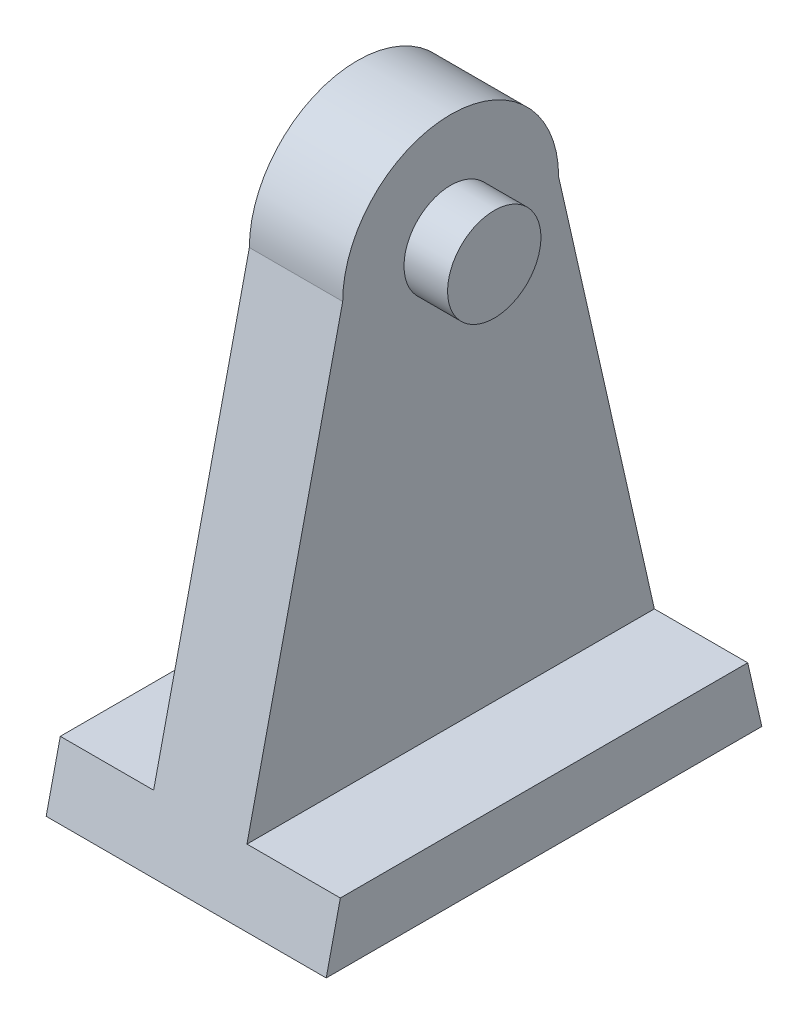
ISO-10303-21;
HEADER;
FILE_DESCRIPTION(('STEP AP214'),'2;1');
FILE_NAME('part.step','',(''),(''),'','','');
FILE_SCHEMA(('AUTOMOTIVE_DESIGN { 1 0 10303 214 1 1 1 1 }'));
ENDSEC;
DATA;
#1=APPLICATION_CONTEXT('core data for automotive mechanical design processes');
#2=APPLICATION_PROTOCOL_DEFINITION('international standard','automotive_design',2000,#1);
#3=PRODUCT_CONTEXT('',#1,'mechanical');
#4=PRODUCT('Part','Part','',(#3));
#5=PRODUCT_RELATED_PRODUCT_CATEGORY('part','',(#4));
#6=PRODUCT_DEFINITION_FORMATION('','',#4);
#7=PRODUCT_DEFINITION_CONTEXT('part definition',#1,'design');
#8=PRODUCT_DEFINITION('design','',#6,#7);
#9=PRODUCT_DEFINITION_SHAPE('','',#8);
#10=(LENGTH_UNIT() NAMED_UNIT(*) SI_UNIT(.MILLI.,.METRE.));
#11=(NAMED_UNIT(*) PLANE_ANGLE_UNIT() SI_UNIT($,.RADIAN.));
#12=(NAMED_UNIT(*) SI_UNIT($,.STERADIAN.) SOLID_ANGLE_UNIT());
#13=UNCERTAINTY_MEASURE_WITH_UNIT(LENGTH_MEASURE(1.E-05),#10,'distance_accuracy_value','');
#14=(GEOMETRIC_REPRESENTATION_CONTEXT(3) GLOBAL_UNCERTAINTY_ASSIGNED_CONTEXT((#13)) GLOBAL_UNIT_ASSIGNED_CONTEXT((#10,
#11,#12)) REPRESENTATION_CONTEXT('',''));
#15=CARTESIAN_POINT('',(0.,0.,0.));
#16=DIRECTION('',(0.,0.,1.));
#17=DIRECTION('',(1.,0.,0.));
#18=AXIS2_PLACEMENT_3D('',#15,#16,#17);
#19=CARTESIAN_POINT('',(7.5,0.,0.));
#20=DIRECTION('',(0.,1.,0.));
#21=DIRECTION('',(0.,0.,1.));
#22=AXIS2_PLACEMENT_3D('',#19,#20,#21);
#23=PLANE('',#22);
#24=DIRECTION('',(-1.,0.,0.));
#25=VECTOR('',#24,1.);
#26=CARTESIAN_POINT('',(7.5,0.,35.));
#27=LINE('',#26,#25);
#28=CARTESIAN_POINT('',(22.5,0.,35.));
#29=VERTEX_POINT('',#28);
#30=CARTESIAN_POINT('',(-22.5,0.,35.));
#31=VERTEX_POINT('',#30);
#32=EDGE_CURVE('E159',#29,#31,#27,.T.);
#33=ORIENTED_EDGE('',*,*,#32,.T.);
#34=DIRECTION('',(0.,0.,-1.));
#35=VECTOR('',#34,1.);
#36=CARTESIAN_POINT('',(-22.5,0.,0.));
#37=LINE('',#36,#35);
#38=CARTESIAN_POINT('',(-22.5,0.,-35.));
#39=VERTEX_POINT('',#38);
#40=EDGE_CURVE('E110',#31,#39,#37,.T.);
#41=ORIENTED_EDGE('',*,*,#40,.T.);
#42=DIRECTION('',(-1.,0.,0.));
#43=VECTOR('',#42,1.);
#44=CARTESIAN_POINT('',(7.5,0.,-35.));
#45=LINE('',#44,#43);
#46=CARTESIAN_POINT('',(22.5,0.,-35.));
#47=VERTEX_POINT('',#46);
#48=EDGE_CURVE('E51',#47,#39,#45,.T.);
#49=ORIENTED_EDGE('',*,*,#48,.F.);
#50=DIRECTION('',(0.,0.,-1.));
#51=VECTOR('',#50,1.);
#52=CARTESIAN_POINT('',(22.5,0.,0.));
#53=LINE('',#52,#51);
#54=EDGE_CURVE('E108',#29,#47,#53,.T.);
#55=ORIENTED_EDGE('',*,*,#54,.F.);
#56=EDGE_LOOP('',(#33,#41,#49,#55));
#57=FACE_BOUND('',#56,.T.);
#58=ADVANCED_FACE('F43',(#57),#23,.F.);
#59=CARTESIAN_POINT('',(7.5,7.54982245787887,-33.2876591315656));
#60=DIRECTION('',(0.,0.221187759183031,-0.975231241905011));
#61=DIRECTION('',(0.,0.975231241905011,0.221187759183031));
#62=AXIS2_PLACEMENT_3D('',#59,#60,#61);
#63=PLANE('',#62);
#64=DIRECTION('',(0.,-0.975231241905011,-0.221187759183031));
#65=VECTOR('',#64,1.);
#66=CARTESIAN_POINT('',(7.5,7.54982245787887,-33.2876591315656));
#67=LINE('',#66,#65);
#68=CARTESIAN_POINT('',(7.5,77.82,-17.35));
#69=VERTEX_POINT('',#68);
#70=CARTESIAN_POINT('',(7.5,10.,-32.7319455152917));
#71=VERTEX_POINT('',#70);
#72=EDGE_CURVE('E153',#69,#71,#67,.T.);
#73=ORIENTED_EDGE('',*,*,#72,.T.);
#74=DIRECTION('',(-1.,0.,0.));
#75=VECTOR('',#74,1.);
#76=CARTESIAN_POINT('',(22.5,10.,-32.7319455152917));
#77=LINE('',#76,#75);
#78=CARTESIAN_POINT('',(22.5,10.,-32.7319455152917));
#79=VERTEX_POINT('',#78);
#80=EDGE_CURVE('E130',#79,#71,#77,.T.);
#81=ORIENTED_EDGE('',*,*,#80,.F.);
#82=DIRECTION('',(0.,-0.975231241905011,-0.221187759183031));
#83=VECTOR('',#82,1.);
#84=CARTESIAN_POINT('',(22.5,7.54982245787887,-33.2876591315656));
#85=LINE('',#84,#83);
#86=EDGE_CURVE('E122',#79,#47,#85,.T.);
#87=ORIENTED_EDGE('',*,*,#86,.T.);
#88=ORIENTED_EDGE('',*,*,#48,.T.);
#89=DIRECTION('',(0.,-0.975231241905011,-0.221187759183031));
#90=VECTOR('',#89,1.);
#91=CARTESIAN_POINT('',(-22.5,7.54982245787887,-33.2876591315656));
#92=LINE('',#91,#90);
#93=CARTESIAN_POINT('',(-22.5,10.,-32.7319455152917));
#94=VERTEX_POINT('',#93);
#95=EDGE_CURVE('E139',#94,#39,#92,.T.);
#96=ORIENTED_EDGE('',*,*,#95,.F.);
#97=CARTESIAN_POINT('',(-7.49999999999999,10.,-32.7319455152917));
#98=VERTEX_POINT('',#97);
#99=EDGE_CURVE('E149',#98,#94,#77,.T.);
#100=ORIENTED_EDGE('',*,*,#99,.F.);
#101=DIRECTION('',(0.,-0.975231241905011,-0.221187759183031));
#102=VECTOR('',#101,1.);
#103=CARTESIAN_POINT('',(-7.5,7.54982245787887,-33.2876591315656));
#104=LINE('',#103,#102);
#105=CARTESIAN_POINT('',(-7.5,77.82,-17.35));
#106=VERTEX_POINT('',#105);
#107=EDGE_CURVE('E152',#106,#98,#104,.T.);
#108=ORIENTED_EDGE('',*,*,#107,.F.);
#109=DIRECTION('',(-1.,0.,0.));
#110=VECTOR('',#109,1.);
#111=CARTESIAN_POINT('',(7.5,77.82,-17.35));
#112=LINE('',#111,#110);
#113=EDGE_CURVE('E115',#69,#106,#112,.T.);
#114=ORIENTED_EDGE('',*,*,#113,.F.);
#115=EDGE_LOOP('',(#73,#81,#87,#88,#96,#100,#108,#114));
#116=FACE_BOUND('',#115,.T.);
#117=ADVANCED_FACE('F128',(#116),#63,.T.);
#118=CARTESIAN_POINT('',(7.5,77.82,0.));
#119=DIRECTION('',(-1.,0.,0.));
#120=DIRECTION('',(0.,0.,1.));
#121=AXIS2_PLACEMENT_3D('',#118,#119,#120);
#122=CYLINDRICAL_SURFACE('',#121,17.35);
#123=CARTESIAN_POINT('',(-7.5,77.82,0.));
#124=DIRECTION('',(1.,0.,0.));
#125=DIRECTION('',(0.,0.,-1.));
#126=AXIS2_PLACEMENT_3D('',#123,#124,#125);
#127=CIRCLE('',#126,17.35);
#128=CARTESIAN_POINT('',(-7.5,77.82,17.35));
#129=VERTEX_POINT('',#128);
#130=EDGE_CURVE('E162',#106,#129,#127,.T.);
#131=ORIENTED_EDGE('',*,*,#130,.T.);
#132=DIRECTION('',(-1.,0.,0.));
#133=VECTOR('',#132,1.);
#134=CARTESIAN_POINT('',(7.5,77.82,17.35));
#135=LINE('',#134,#133);
#136=CARTESIAN_POINT('',(7.5,77.82,17.35));
#137=VERTEX_POINT('',#136);
#138=EDGE_CURVE('E167',#137,#129,#135,.T.);
#139=ORIENTED_EDGE('',*,*,#138,.F.);
#140=CARTESIAN_POINT('',(7.5,77.82,0.));
#141=DIRECTION('',(1.,0.,0.));
#142=DIRECTION('',(0.,0.,-1.));
#143=AXIS2_PLACEMENT_3D('',#140,#141,#142);
#144=CIRCLE('',#143,17.35);
#145=EDGE_CURVE('E155',#69,#137,#144,.T.);
#146=ORIENTED_EDGE('',*,*,#145,.F.);
#147=ORIENTED_EDGE('',*,*,#113,.T.);
#148=EDGE_LOOP('',(#131,#139,#146,#147));
#149=FACE_BOUND('',#148,.T.);
#150=ADVANCED_FACE('F173',(#149),#122,.T.);
#151=CARTESIAN_POINT('',(7.5,7.54982245787887,33.2876591315656));
#152=DIRECTION('',(0.,-0.221187759183031,-0.975231241905011));
#153=DIRECTION('',(0.,0.975231241905011,-0.221187759183031));
#154=AXIS2_PLACEMENT_3D('',#151,#152,#153);
#155=PLANE('',#154);
#156=DIRECTION('',(0.,-0.975231241905011,0.221187759183031));
#157=VECTOR('',#156,1.);
#158=CARTESIAN_POINT('',(-7.5,7.54982245787887,33.2876591315656));
#159=LINE('',#158,#157);
#160=CARTESIAN_POINT('',(-7.49999999999999,9.99999999999999,32.7319455152917));
#161=VERTEX_POINT('',#160);
#162=EDGE_CURVE('E156',#129,#161,#159,.T.);
#163=ORIENTED_EDGE('',*,*,#162,.T.);
#164=DIRECTION('',(-1.,0.,0.));
#165=VECTOR('',#164,1.);
#166=CARTESIAN_POINT('',(22.5,9.99999999999999,32.7319455152917));
#167=LINE('',#166,#165);
#168=CARTESIAN_POINT('',(-22.5,9.99999999999999,32.7319455152917));
#169=VERTEX_POINT('',#168);
#170=EDGE_CURVE('E137',#161,#169,#167,.T.);
#171=ORIENTED_EDGE('',*,*,#170,.T.);
#172=DIRECTION('',(0.,-0.975231241905011,0.221187759183031));
#173=VECTOR('',#172,1.);
#174=CARTESIAN_POINT('',(-22.5,7.54982245787887,33.2876591315656));
#175=LINE('',#174,#173);
#176=EDGE_CURVE('E126',#169,#31,#175,.T.);
#177=ORIENTED_EDGE('',*,*,#176,.T.);
#178=ORIENTED_EDGE('',*,*,#32,.F.);
#179=DIRECTION('',(0.,-0.975231241905011,0.221187759183031));
#180=VECTOR('',#179,1.);
#181=CARTESIAN_POINT('',(22.5,7.54982245787887,33.2876591315656));
#182=LINE('',#181,#180);
#183=CARTESIAN_POINT('',(22.5,9.99999999999999,32.7319455152917));
#184=VERTEX_POINT('',#183);
#185=EDGE_CURVE('E125',#184,#29,#182,.T.);
#186=ORIENTED_EDGE('',*,*,#185,.F.);
#187=CARTESIAN_POINT('',(7.5,9.99999999999999,32.7319455152917));
#188=VERTEX_POINT('',#187);
#189=EDGE_CURVE('E146',#184,#188,#167,.T.);
#190=ORIENTED_EDGE('',*,*,#189,.T.);
#191=DIRECTION('',(0.,-0.975231241905011,0.221187759183031));
#192=VECTOR('',#191,1.);
#193=CARTESIAN_POINT('',(7.5,7.54982245787887,33.2876591315656));
#194=LINE('',#193,#192);
#195=EDGE_CURVE('E58',#137,#188,#194,.T.);
#196=ORIENTED_EDGE('',*,*,#195,.F.);
#197=ORIENTED_EDGE('',*,*,#138,.T.);
#198=EDGE_LOOP('',(#163,#171,#177,#178,#186,#190,#196,#197));
#199=FACE_BOUND('',#198,.T.);
#200=ADVANCED_FACE('F184',(#199),#155,.F.);
#201=CARTESIAN_POINT('',(7.5,0.,0.));
#202=DIRECTION('',(1.,0.,0.));
#203=DIRECTION('',(0.,0.,-1.));
#204=AXIS2_PLACEMENT_3D('',#201,#202,#203);
#205=PLANE('',#204);
#206=CARTESIAN_POINT('',(7.5,77.82,0.));
#207=DIRECTION('',(1.,0.,0.));
#208=DIRECTION('',(0.,0.,-1.));
#209=AXIS2_PLACEMENT_3D('',#206,#207,#208);
#210=CIRCLE('',#209,7.5);
#211=CARTESIAN_POINT('',(7.5,77.82,7.5));
#212=VERTEX_POINT('',#211);
#213=EDGE_CURVE('E46',#212,#212,#210,.F.);
#214=ORIENTED_EDGE('',*,*,#213,.T.);
#215=EDGE_LOOP('',(#214));
#216=FACE_BOUND('',#215,.T.);
#217=DIRECTION('',(0.,0.,1.));
#218=VECTOR('',#217,1.);
#219=CARTESIAN_POINT('',(7.5,10.,0.));
#220=LINE('',#219,#218);
#221=EDGE_CURVE('E62',#71,#188,#220,.T.);
#222=ORIENTED_EDGE('',*,*,#221,.F.);
#223=ORIENTED_EDGE('',*,*,#72,.F.);
#224=ORIENTED_EDGE('',*,*,#145,.T.);
#225=ORIENTED_EDGE('',*,*,#195,.T.);
#226=EDGE_LOOP('',(#222,#223,#224,#225));
#227=FACE_BOUND('',#226,.T.);
#228=ADVANCED_FACE('F210',(#216,#227),#205,.T.);
#229=CARTESIAN_POINT('',(-7.5,0.,0.));
#230=DIRECTION('',(1.,0.,0.));
#231=DIRECTION('',(0.,0.,-1.));
#232=AXIS2_PLACEMENT_3D('',#229,#230,#231);
#233=PLANE('',#232);
#234=ORIENTED_EDGE('',*,*,#107,.T.);
#235=DIRECTION('',(0.,0.,1.));
#236=VECTOR('',#235,1.);
#237=CARTESIAN_POINT('',(-7.5,10.,0.));
#238=LINE('',#237,#236);
#239=EDGE_CURVE('E11',#98,#161,#238,.T.);
#240=ORIENTED_EDGE('',*,*,#239,.T.);
#241=ORIENTED_EDGE('',*,*,#162,.F.);
#242=ORIENTED_EDGE('',*,*,#130,.F.);
#243=EDGE_LOOP('',(#234,#240,#241,#242));
#244=FACE_BOUND('',#243,.T.);
#245=ADVANCED_FACE('F178',(#244),#233,.F.);
#246=CARTESIAN_POINT('',(-22.5,0.,0.));
#247=DIRECTION('',(1.,0.,0.));
#248=DIRECTION('',(0.,0.,-1.));
#249=AXIS2_PLACEMENT_3D('',#246,#247,#248);
#250=PLANE('',#249);
#251=ORIENTED_EDGE('',*,*,#40,.F.);
#252=ORIENTED_EDGE('',*,*,#176,.F.);
#253=DIRECTION('',(0.,0.,-1.));
#254=VECTOR('',#253,1.);
#255=CARTESIAN_POINT('',(-22.5,10.,0.));
#256=LINE('',#255,#254);
#257=EDGE_CURVE('E141',#169,#94,#256,.T.);
#258=ORIENTED_EDGE('',*,*,#257,.T.);
#259=ORIENTED_EDGE('',*,*,#95,.T.);
#260=EDGE_LOOP('',(#251,#252,#258,#259));
#261=FACE_BOUND('',#260,.T.);
#262=ADVANCED_FACE('F196',(#261),#250,.F.);
#263=CARTESIAN_POINT('',(22.5,10.,0.));
#264=DIRECTION('',(0.,1.,0.));
#265=DIRECTION('',(0.,0.,1.));
#266=AXIS2_PLACEMENT_3D('',#263,#264,#265);
#267=PLANE('',#266);
#268=ORIENTED_EDGE('',*,*,#239,.F.);
#269=ORIENTED_EDGE('',*,*,#99,.T.);
#270=ORIENTED_EDGE('',*,*,#257,.F.);
#271=ORIENTED_EDGE('',*,*,#170,.F.);
#272=EDGE_LOOP('',(#268,#269,#270,#271));
#273=FACE_BOUND('',#272,.T.);
#274=ADVANCED_FACE('F182',(#273),#267,.T.);
#275=ORIENTED_EDGE('',*,*,#80,.T.);
#276=ORIENTED_EDGE('',*,*,#221,.T.);
#277=ORIENTED_EDGE('',*,*,#189,.F.);
#278=DIRECTION('',(0.,0.,-1.));
#279=VECTOR('',#278,1.);
#280=CARTESIAN_POINT('',(22.5,10.,0.));
#281=LINE('',#280,#279);
#282=EDGE_CURVE('E131',#184,#79,#281,.T.);
#283=ORIENTED_EDGE('',*,*,#282,.T.);
#284=EDGE_LOOP('',(#275,#276,#277,#283));
#285=FACE_BOUND('',#284,.T.);
#286=ADVANCED_FACE('F187',(#285),#267,.T.);
#287=CARTESIAN_POINT('',(22.5,0.,0.));
#288=DIRECTION('',(1.,0.,0.));
#289=DIRECTION('',(0.,0.,-1.));
#290=AXIS2_PLACEMENT_3D('',#287,#288,#289);
#291=PLANE('',#290);
#292=ORIENTED_EDGE('',*,*,#54,.T.);
#293=ORIENTED_EDGE('',*,*,#86,.F.);
#294=ORIENTED_EDGE('',*,*,#282,.F.);
#295=ORIENTED_EDGE('',*,*,#185,.T.);
#296=EDGE_LOOP('',(#292,#293,#294,#295));
#297=FACE_BOUND('',#296,.T.);
#298=ADVANCED_FACE('F120',(#297),#291,.T.);
#299=CARTESIAN_POINT('',(14.5,77.82,0.));
#300=DIRECTION('',(-1.,0.,0.));
#301=DIRECTION('',(0.,0.,1.));
#302=AXIS2_PLACEMENT_3D('',#299,#300,#301);
#303=CYLINDRICAL_SURFACE('',#302,7.5);
#304=CARTESIAN_POINT('',(14.5,77.82,0.));
#305=DIRECTION('',(1.,0.,0.));
#306=DIRECTION('',(0.,0.,-1.));
#307=AXIS2_PLACEMENT_3D('',#304,#305,#306);
#308=CIRCLE('',#307,7.5);
#309=CARTESIAN_POINT('',(14.5,77.82,7.5));
#310=VERTEX_POINT('',#309);
#311=EDGE_CURVE('E220',#310,#310,#308,.T.);
#312=CARTESIAN_POINT('',(7.5,77.82,7.5));
#313=CARTESIAN_POINT('',(7.57291666666667,77.82,7.5));
#314=CARTESIAN_POINT('',(7.64583333333333,77.82,7.5));
#315=CARTESIAN_POINT('',(7.79166666666667,77.82,7.5));
#316=CARTESIAN_POINT('',(7.86458333333333,77.82,7.5));
#317=CARTESIAN_POINT('',(8.01041666666667,77.82,7.5));
#318=CARTESIAN_POINT('',(8.08333333333333,77.82,7.5));
#319=CARTESIAN_POINT('',(8.22916666666667,77.82,7.5));
#320=CARTESIAN_POINT('',(8.30208333333333,77.82,7.5));
#321=CARTESIAN_POINT('',(8.44791666666667,77.82,7.5));
#322=CARTESIAN_POINT('',(8.52083333333333,77.82,7.5));
#323=CARTESIAN_POINT('',(8.66666666666667,77.82,7.5));
#324=CARTESIAN_POINT('',(8.73958333333333,77.82,7.5));
#325=CARTESIAN_POINT('',(8.88541666666667,77.82,7.5));
#326=CARTESIAN_POINT('',(8.95833333333333,77.82,7.5));
#327=CARTESIAN_POINT('',(9.10416666666667,77.82,7.5));
#328=CARTESIAN_POINT('',(9.17708333333333,77.82,7.5));
#329=CARTESIAN_POINT('',(9.32291666666666,77.82,7.5));
#330=CARTESIAN_POINT('',(9.39583333333333,77.82,7.5));
#331=CARTESIAN_POINT('',(9.54166666666667,77.82,7.5));
#332=CARTESIAN_POINT('',(9.61458333333333,77.82,7.5));
#333=CARTESIAN_POINT('',(9.76041666666667,77.82,7.5));
#334=CARTESIAN_POINT('',(9.83333333333333,77.82,7.5));
#335=CARTESIAN_POINT('',(9.97916666666667,77.82,7.5));
#336=CARTESIAN_POINT('',(10.0520833333333,77.82,7.5));
#337=CARTESIAN_POINT('',(10.1979166666667,77.82,7.5));
#338=CARTESIAN_POINT('',(10.2708333333333,77.82,7.5));
#339=CARTESIAN_POINT('',(10.4166666666667,77.82,7.5));
#340=CARTESIAN_POINT('',(10.4895833333333,77.82,7.5));
#341=CARTESIAN_POINT('',(10.6354166666667,77.82,7.5));
#342=CARTESIAN_POINT('',(10.7083333333333,77.82,7.5));
#343=CARTESIAN_POINT('',(10.8541666666667,77.82,7.5));
#344=CARTESIAN_POINT('',(10.9270833333333,77.82,7.5));
#345=CARTESIAN_POINT('',(11.0729166666667,77.82,7.5));
#346=CARTESIAN_POINT('',(11.1458333333333,77.82,7.5));
#347=CARTESIAN_POINT('',(11.2916666666667,77.82,7.5));
#348=CARTESIAN_POINT('',(11.3645833333333,77.82,7.5));
#349=CARTESIAN_POINT('',(11.5104166666667,77.82,7.5));
#350=CARTESIAN_POINT('',(11.5833333333333,77.82,7.5));
#351=CARTESIAN_POINT('',(11.7291666666667,77.82,7.5));
#352=CARTESIAN_POINT('',(11.8020833333333,77.82,7.5));
#353=CARTESIAN_POINT('',(11.9479166666667,77.82,7.5));
#354=CARTESIAN_POINT('',(12.0208333333333,77.82,7.5));
#355=CARTESIAN_POINT('',(12.1666666666667,77.82,7.5));
#356=CARTESIAN_POINT('',(12.2395833333333,77.82,7.5));
#357=CARTESIAN_POINT('',(12.3854166666667,77.82,7.5));
#358=CARTESIAN_POINT('',(12.4583333333333,77.82,7.5));
#359=CARTESIAN_POINT('',(12.6041666666667,77.82,7.5));
#360=CARTESIAN_POINT('',(12.6770833333333,77.82,7.5));
#361=CARTESIAN_POINT('',(12.8229166666667,77.82,7.5));
#362=CARTESIAN_POINT('',(12.8958333333333,77.82,7.5));
#363=CARTESIAN_POINT('',(13.0416666666667,77.82,7.5));
#364=CARTESIAN_POINT('',(13.1145833333333,77.82,7.5));
#365=CARTESIAN_POINT('',(13.2604166666667,77.82,7.5));
#366=CARTESIAN_POINT('',(13.3333333333333,77.82,7.5));
#367=CARTESIAN_POINT('',(13.4791666666667,77.82,7.5));
#368=CARTESIAN_POINT('',(13.5520833333333,77.82,7.5));
#369=CARTESIAN_POINT('',(13.6979166666667,77.82,7.5));
#370=CARTESIAN_POINT('',(13.7708333333333,77.82,7.5));
#371=CARTESIAN_POINT('',(13.9166666666667,77.82,7.5));
#372=CARTESIAN_POINT('',(13.9895833333333,77.82,7.5));
#373=CARTESIAN_POINT('',(14.1354166666667,77.82,7.5));
#374=CARTESIAN_POINT('',(14.2083333333333,77.82,7.5));
#375=CARTESIAN_POINT('',(14.3541666666667,77.82,7.5));
#376=CARTESIAN_POINT('',(14.4270833333333,77.82,7.5));
#377=CARTESIAN_POINT('',(14.5,77.82,7.5));
#378=B_SPLINE_CURVE_WITH_KNOTS('',3,(#312,#313,#314,#315,#316,#317,#318,#319,#320,#321,#322,
#323,#324,#325,#326,#327,#328,#329,#330,#331,#332,#333,#334,#335,#336,#337,#338,#339,#340,#341,
#342,#343,#344,#345,#346,#347,#348,#349,#350,#351,#352,#353,#354,#355,#356,#357,#358,#359,#360,
#361,#362,#363,#364,#365,#366,#367,#368,#369,#370,#371,#372,#373,#374,#375,#376,#377),
.UNSPECIFIED.,.F.,.F.,(4,2,2,2,2,2,2,2,2,2,2,2,2,2,2,2,2,2,2,2,2,2,2,2,2,2,2,2,2,2,2,2,4),(0.,
0.21875,0.437500000000001,0.656250000000001,0.875,1.09375,1.3125,1.53125,1.75,1.96875,2.1875,
2.40625,2.625,2.84375,3.0625,3.28125,3.5,3.71875,3.9375,4.15625,4.375,4.59375,4.8125,5.03125,
5.25,5.46875,5.6875,5.90625,6.125,6.34375,6.5625,6.78125,7.),.UNSPECIFIED.);
#379=EDGE_CURVE('BSEAM194',#212,#310,#378,.T.);
#380=ORIENTED_EDGE('',*,*,#213,.F.);
#381=ORIENTED_EDGE('',*,*,#311,.F.);
#382=ORIENTED_EDGE('',*,*,#379,.T.);
#383=ORIENTED_EDGE('',*,*,#379,.F.);
#384=EDGE_LOOP('',(#380,#382,#381,#383));
#385=FACE_BOUND('',#384,.T.);
#386=ADVANCED_FACE('F194',(#385),#303,.T.);
#387=CARTESIAN_POINT('',(14.5,77.82,0.));
#388=DIRECTION('',(1.,0.,0.));
#389=DIRECTION('',(0.,0.,-1.));
#390=AXIS2_PLACEMENT_3D('',#387,#388,#389);
#391=PLANE('',#390);
#392=ORIENTED_EDGE('',*,*,#311,.T.);
#393=EDGE_LOOP('',(#392));
#394=FACE_BOUND('',#393,.T.);
#395=ADVANCED_FACE('F224',(#394),#391,.T.);
#396=CLOSED_SHELL('',(#58,#117,#150,#200,#228,#245,#262,#274,#286,#298,#386,#395));
#397=MANIFOLD_SOLID_BREP('B2',#396);
#398=ADVANCED_BREP_SHAPE_REPRESENTATION('',(#18,#397),#14);
#399=SHAPE_DEFINITION_REPRESENTATION(#9,#398);
ENDSEC;
END-ISO-10303-21;
